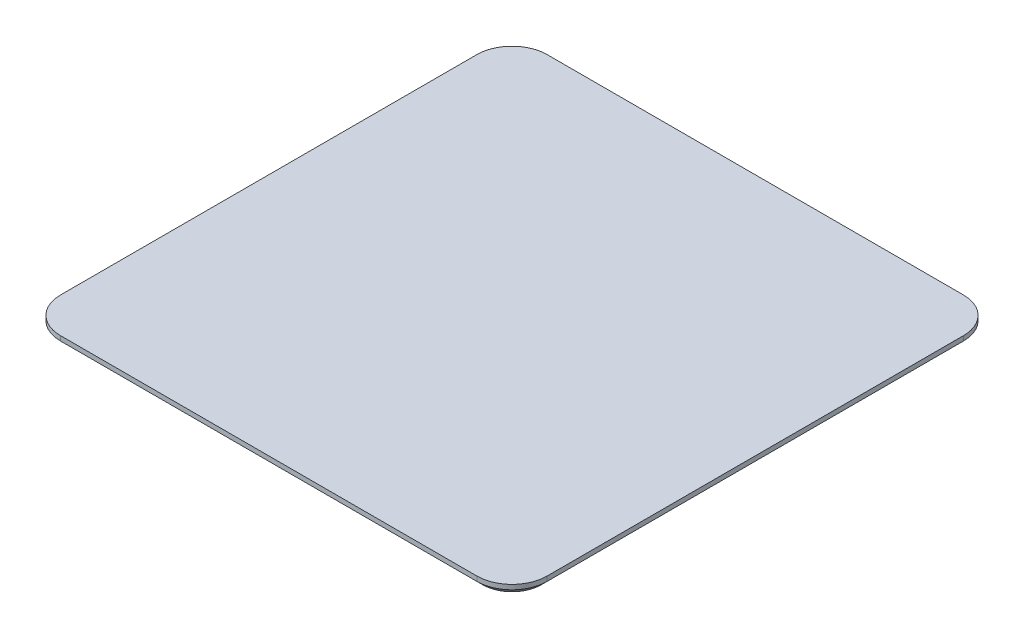
ISO-10303-21;
HEADER;
FILE_DESCRIPTION(('STEP AP214'),'2;1');
FILE_NAME('part.step','',(''),(''),'','','');
FILE_SCHEMA(('AUTOMOTIVE_DESIGN { 1 0 10303 214 1 1 1 1 }'));
ENDSEC;
DATA;
#1=APPLICATION_CONTEXT('core data for automotive mechanical design processes');
#2=APPLICATION_PROTOCOL_DEFINITION('international standard','automotive_design',2000,#1);
#3=PRODUCT_CONTEXT('',#1,'mechanical');
#4=PRODUCT('Part','Part','',(#3));
#5=PRODUCT_RELATED_PRODUCT_CATEGORY('part','',(#4));
#6=PRODUCT_DEFINITION_FORMATION('','',#4);
#7=PRODUCT_DEFINITION_CONTEXT('part definition',#1,'design');
#8=PRODUCT_DEFINITION('design','',#6,#7);
#9=PRODUCT_DEFINITION_SHAPE('','',#8);
#10=(LENGTH_UNIT() NAMED_UNIT(*) SI_UNIT(.MILLI.,.METRE.));
#11=(NAMED_UNIT(*) PLANE_ANGLE_UNIT() SI_UNIT($,.RADIAN.));
#12=(NAMED_UNIT(*) SI_UNIT($,.STERADIAN.) SOLID_ANGLE_UNIT());
#13=UNCERTAINTY_MEASURE_WITH_UNIT(LENGTH_MEASURE(1.E-05),#10,'distance_accuracy_value','');
#14=(GEOMETRIC_REPRESENTATION_CONTEXT(3) GLOBAL_UNCERTAINTY_ASSIGNED_CONTEXT((#13)) GLOBAL_UNIT_ASSIGNED_CONTEXT((#10,
#11,#12)) REPRESENTATION_CONTEXT('',''));
#15=CARTESIAN_POINT('',(0.,0.,0.));
#16=DIRECTION('',(0.,0.,1.));
#17=DIRECTION('',(1.,0.,0.));
#18=AXIS2_PLACEMENT_3D('',#15,#16,#17);
#19=CARTESIAN_POINT('',(20.75,0.9,20.75));
#20=DIRECTION('',(-1.,0.,0.));
#21=DIRECTION('',(0.,0.,1.));
#22=AXIS2_PLACEMENT_3D('',#19,#20,#21);
#23=PLANE('',#22);
#24=DIRECTION('',(0.,-1.,0.));
#25=VECTOR('',#24,1.);
#26=CARTESIAN_POINT('',(20.75,0.9,17.75));
#27=LINE('',#26,#25);
#28=CARTESIAN_POINT('',(20.75,0.9,17.75));
#29=VERTEX_POINT('',#28);
#30=CARTESIAN_POINT('',(20.75,0.5,17.75));
#31=VERTEX_POINT('',#30);
#32=EDGE_CURVE('E180',#29,#31,#27,.T.);
#33=ORIENTED_EDGE('',*,*,#32,.T.);
#34=DIRECTION('',(0.,0.,-1.));
#35=VECTOR('',#34,1.);
#36=CARTESIAN_POINT('',(20.75,0.5,-17.75));
#37=LINE('',#36,#35);
#38=CARTESIAN_POINT('',(20.75,0.5,-17.75));
#39=VERTEX_POINT('',#38);
#40=EDGE_CURVE('E187',#31,#39,#37,.T.);
#41=ORIENTED_EDGE('',*,*,#40,.T.);
#42=DIRECTION('',(0.,-1.,0.));
#43=VECTOR('',#42,1.);
#44=CARTESIAN_POINT('',(20.75,0.9,-17.75));
#45=LINE('',#44,#43);
#46=CARTESIAN_POINT('',(20.75,0.9,-17.75));
#47=VERTEX_POINT('',#46);
#48=EDGE_CURVE('E184',#39,#47,#45,.F.);
#49=ORIENTED_EDGE('',*,*,#48,.T.);
#50=DIRECTION('',(0.,0.,-1.));
#51=VECTOR('',#50,1.);
#52=CARTESIAN_POINT('',(20.75,0.9,20.75));
#53=LINE('',#52,#51);
#54=EDGE_CURVE('E261',#29,#47,#53,.T.);
#55=ORIENTED_EDGE('',*,*,#54,.F.);
#56=EDGE_LOOP('',(#33,#41,#49,#55));
#57=FACE_BOUND('',#56,.T.);
#58=ADVANCED_FACE('F41',(#57),#23,.F.);
#59=CARTESIAN_POINT('',(-20.75,0.9,-20.75));
#60=DIRECTION('',(0.,0.,1.));
#61=DIRECTION('',(1.,0.,0.));
#62=AXIS2_PLACEMENT_3D('',#59,#60,#61);
#63=PLANE('',#62);
#64=DIRECTION('',(0.,-1.,0.));
#65=VECTOR('',#64,1.);
#66=CARTESIAN_POINT('',(17.75,0.9,-20.75));
#67=LINE('',#66,#65);
#68=CARTESIAN_POINT('',(17.75,0.9,-20.75));
#69=VERTEX_POINT('',#68);
#70=CARTESIAN_POINT('',(17.75,0.5,-20.75));
#71=VERTEX_POINT('',#70);
#72=EDGE_CURVE('E154',#69,#71,#67,.T.);
#73=ORIENTED_EDGE('',*,*,#72,.T.);
#74=DIRECTION('',(-1.,0.,0.));
#75=VECTOR('',#74,1.);
#76=CARTESIAN_POINT('',(-17.75,0.5,-20.75));
#77=LINE('',#76,#75);
#78=CARTESIAN_POINT('',(-17.75,0.5,-20.75));
#79=VERTEX_POINT('',#78);
#80=EDGE_CURVE('E222',#71,#79,#77,.T.);
#81=ORIENTED_EDGE('',*,*,#80,.T.);
#82=DIRECTION('',(0.,-1.,0.));
#83=VECTOR('',#82,1.);
#84=CARTESIAN_POINT('',(-17.75,0.9,-20.75));
#85=LINE('',#84,#83);
#86=CARTESIAN_POINT('',(-17.75,0.9,-20.75));
#87=VERTEX_POINT('',#86);
#88=EDGE_CURVE('E159',#79,#87,#85,.F.);
#89=ORIENTED_EDGE('',*,*,#88,.T.);
#90=DIRECTION('',(-1.,0.,0.));
#91=VECTOR('',#90,1.);
#92=CARTESIAN_POINT('',(-20.75,0.9,-20.75));
#93=LINE('',#92,#91);
#94=EDGE_CURVE('E141',#69,#87,#93,.T.);
#95=ORIENTED_EDGE('',*,*,#94,.F.);
#96=EDGE_LOOP('',(#73,#81,#89,#95));
#97=FACE_BOUND('',#96,.T.);
#98=ADVANCED_FACE('F306',(#97),#63,.F.);
#99=CARTESIAN_POINT('',(-20.75,0.9,20.75));
#100=DIRECTION('',(1.,0.,0.));
#101=DIRECTION('',(0.,0.,-1.));
#102=AXIS2_PLACEMENT_3D('',#99,#100,#101);
#103=PLANE('',#102);
#104=DIRECTION('',(0.,-1.,0.));
#105=VECTOR('',#104,1.);
#106=CARTESIAN_POINT('',(-20.75,0.9,-17.75));
#107=LINE('',#106,#105);
#108=CARTESIAN_POINT('',(-20.75,0.9,-17.75));
#109=VERTEX_POINT('',#108);
#110=CARTESIAN_POINT('',(-20.75,0.5,-17.75));
#111=VERTEX_POINT('',#110);
#112=EDGE_CURVE('E147',#109,#111,#107,.T.);
#113=ORIENTED_EDGE('',*,*,#112,.T.);
#114=DIRECTION('',(0.,0.,1.));
#115=VECTOR('',#114,1.);
#116=CARTESIAN_POINT('',(-20.75,0.5,17.75));
#117=LINE('',#116,#115);
#118=CARTESIAN_POINT('',(-20.75,0.5,17.75));
#119=VERTEX_POINT('',#118);
#120=EDGE_CURVE('E11',#111,#119,#117,.T.);
#121=ORIENTED_EDGE('',*,*,#120,.T.);
#122=DIRECTION('',(0.,-1.,0.));
#123=VECTOR('',#122,1.);
#124=CARTESIAN_POINT('',(-20.75,0.9,17.75));
#125=LINE('',#124,#123);
#126=CARTESIAN_POINT('',(-20.75,0.9,17.75));
#127=VERTEX_POINT('',#126);
#128=EDGE_CURVE('E148',#119,#127,#125,.F.);
#129=ORIENTED_EDGE('',*,*,#128,.T.);
#130=DIRECTION('',(0.,0.,1.));
#131=VECTOR('',#130,1.);
#132=CARTESIAN_POINT('',(-20.75,0.9,20.75));
#133=LINE('',#132,#131);
#134=EDGE_CURVE('E138',#109,#127,#133,.T.);
#135=ORIENTED_EDGE('',*,*,#134,.F.);
#136=EDGE_LOOP('',(#113,#121,#129,#135));
#137=FACE_BOUND('',#136,.T.);
#138=ADVANCED_FACE('F146',(#137),#103,.F.);
#139=CARTESIAN_POINT('',(-20.75,0.9,20.75));
#140=DIRECTION('',(0.,0.,-1.));
#141=DIRECTION('',(-1.,0.,0.));
#142=AXIS2_PLACEMENT_3D('',#139,#140,#141);
#143=PLANE('',#142);
#144=DIRECTION('',(0.,-1.,0.));
#145=VECTOR('',#144,1.);
#146=CARTESIAN_POINT('',(-17.75,0.9,20.75));
#147=LINE('',#146,#145);
#148=CARTESIAN_POINT('',(-17.75,0.9,20.75));
#149=VERTEX_POINT('',#148);
#150=CARTESIAN_POINT('',(-17.75,0.5,20.75));
#151=VERTEX_POINT('',#150);
#152=EDGE_CURVE('E176',#149,#151,#147,.T.);
#153=ORIENTED_EDGE('',*,*,#152,.T.);
#154=DIRECTION('',(1.,0.,0.));
#155=VECTOR('',#154,1.);
#156=CARTESIAN_POINT('',(17.75,0.5,20.75));
#157=LINE('',#156,#155);
#158=CARTESIAN_POINT('',(17.75,0.5,20.75));
#159=VERTEX_POINT('',#158);
#160=EDGE_CURVE('E225',#151,#159,#157,.T.);
#161=ORIENTED_EDGE('',*,*,#160,.T.);
#162=DIRECTION('',(0.,-1.,0.));
#163=VECTOR('',#162,1.);
#164=CARTESIAN_POINT('',(17.75,0.9,20.75));
#165=LINE('',#164,#163);
#166=CARTESIAN_POINT('',(17.75,0.9,20.75));
#167=VERTEX_POINT('',#166);
#168=EDGE_CURVE('E143',#159,#167,#165,.F.);
#169=ORIENTED_EDGE('',*,*,#168,.T.);
#170=DIRECTION('',(1.,0.,0.));
#171=VECTOR('',#170,1.);
#172=CARTESIAN_POINT('',(-20.75,0.9,20.75));
#173=LINE('',#172,#171);
#174=EDGE_CURVE('E150',#149,#167,#173,.T.);
#175=ORIENTED_EDGE('',*,*,#174,.F.);
#176=EDGE_LOOP('',(#153,#161,#169,#175));
#177=FACE_BOUND('',#176,.T.);
#178=ADVANCED_FACE('F321',(#177),#143,.F.);
#179=CARTESIAN_POINT('',(0.,0.9,0.));
#180=DIRECTION('',(0.,-1.,0.));
#181=DIRECTION('',(0.,0.,-1.));
#182=AXIS2_PLACEMENT_3D('',#179,#180,#181);
#183=PLANE('',#182);
#184=ORIENTED_EDGE('',*,*,#94,.T.);
#185=CARTESIAN_POINT('',(-17.75,0.9,-17.75));
#186=DIRECTION('',(0.,-1.,0.));
#187=DIRECTION('',(0.,0.,-1.));
#188=AXIS2_PLACEMENT_3D('',#185,#186,#187);
#189=CIRCLE('',#188,3.);
#190=EDGE_CURVE('E135',#87,#109,#189,.F.);
#191=ORIENTED_EDGE('',*,*,#190,.T.);
#192=ORIENTED_EDGE('',*,*,#134,.T.);
#193=CARTESIAN_POINT('',(-17.75,0.9,17.75));
#194=DIRECTION('',(0.,-1.,0.));
#195=DIRECTION('',(0.,0.,-1.));
#196=AXIS2_PLACEMENT_3D('',#193,#194,#195);
#197=CIRCLE('',#196,3.);
#198=EDGE_CURVE('E144',#127,#149,#197,.F.);
#199=ORIENTED_EDGE('',*,*,#198,.T.);
#200=ORIENTED_EDGE('',*,*,#174,.T.);
#201=CARTESIAN_POINT('',(17.75,0.9,17.75));
#202=DIRECTION('',(0.,-1.,0.));
#203=DIRECTION('',(0.,0.,-1.));
#204=AXIS2_PLACEMENT_3D('',#201,#202,#203);
#205=CIRCLE('',#204,3.);
#206=EDGE_CURVE('E166',#167,#29,#205,.F.);
#207=ORIENTED_EDGE('',*,*,#206,.T.);
#208=ORIENTED_EDGE('',*,*,#54,.T.);
#209=CARTESIAN_POINT('',(17.75,0.9,-17.75));
#210=DIRECTION('',(0.,-1.,0.));
#211=DIRECTION('',(0.,0.,-1.));
#212=AXIS2_PLACEMENT_3D('',#209,#210,#211);
#213=CIRCLE('',#212,3.);
#214=EDGE_CURVE('E169',#47,#69,#213,.F.);
#215=ORIENTED_EDGE('',*,*,#214,.T.);
#216=EDGE_LOOP('',(#184,#191,#192,#199,#200,#207,#208,#215));
#217=FACE_BOUND('',#216,.T.);
#218=ADVANCED_FACE('F137',(#217),#183,.F.);
#219=CARTESIAN_POINT('',(0.,0.,0.));
#220=DIRECTION('',(0.,-1.,0.));
#221=DIRECTION('',(0.,0.,-1.));
#222=AXIS2_PLACEMENT_3D('',#219,#220,#221);
#223=PLANE('',#222);
#224=CARTESIAN_POINT('',(17.75,0.,-17.75));
#225=DIRECTION('',(0.,-1.,0.));
#226=DIRECTION('',(0.,0.,-1.));
#227=AXIS2_PLACEMENT_3D('',#224,#225,#226);
#228=CIRCLE('',#227,2.5);
#229=CARTESIAN_POINT('',(17.75,0.,-20.25));
#230=VERTEX_POINT('',#229);
#231=CARTESIAN_POINT('',(20.25,0.,-17.75));
#232=VERTEX_POINT('',#231);
#233=EDGE_CURVE('E209',#230,#232,#228,.T.);
#234=ORIENTED_EDGE('',*,*,#233,.T.);
#235=DIRECTION('',(0.,0.,1.));
#236=VECTOR('',#235,1.);
#237=CARTESIAN_POINT('',(20.25,0.,17.75));
#238=LINE('',#237,#236);
#239=CARTESIAN_POINT('',(20.25,0.,17.75));
#240=VERTEX_POINT('',#239);
#241=EDGE_CURVE('E212',#232,#240,#238,.T.);
#242=ORIENTED_EDGE('',*,*,#241,.T.);
#243=CARTESIAN_POINT('',(17.75,0.,17.75));
#244=DIRECTION('',(0.,-1.,0.));
#245=DIRECTION('',(0.,0.,-1.));
#246=AXIS2_PLACEMENT_3D('',#243,#244,#245);
#247=CIRCLE('',#246,2.5);
#248=CARTESIAN_POINT('',(17.75,0.,20.25));
#249=VERTEX_POINT('',#248);
#250=EDGE_CURVE('E206',#240,#249,#247,.T.);
#251=ORIENTED_EDGE('',*,*,#250,.T.);
#252=DIRECTION('',(-1.,0.,0.));
#253=VECTOR('',#252,1.);
#254=CARTESIAN_POINT('',(-17.75,0.,20.25));
#255=LINE('',#254,#253);
#256=CARTESIAN_POINT('',(-17.75,0.,20.25));
#257=VERTEX_POINT('',#256);
#258=EDGE_CURVE('E200',#249,#257,#255,.T.);
#259=ORIENTED_EDGE('',*,*,#258,.T.);
#260=CARTESIAN_POINT('',(-17.75,0.,17.75));
#261=DIRECTION('',(0.,-1.,0.));
#262=DIRECTION('',(0.,0.,-1.));
#263=AXIS2_PLACEMENT_3D('',#260,#261,#262);
#264=CIRCLE('',#263,2.5);
#265=CARTESIAN_POINT('',(-20.25,0.,17.75));
#266=VERTEX_POINT('',#265);
#267=EDGE_CURVE('E194',#257,#266,#264,.T.);
#268=ORIENTED_EDGE('',*,*,#267,.T.);
#269=DIRECTION('',(0.,0.,-1.));
#270=VECTOR('',#269,1.);
#271=CARTESIAN_POINT('',(-20.25,0.,-17.75));
#272=LINE('',#271,#270);
#273=CARTESIAN_POINT('',(-20.25,0.,-17.75));
#274=VERTEX_POINT('',#273);
#275=EDGE_CURVE('E191',#266,#274,#272,.T.);
#276=ORIENTED_EDGE('',*,*,#275,.T.);
#277=CARTESIAN_POINT('',(-17.75,0.,-17.75));
#278=DIRECTION('',(0.,-1.,0.));
#279=DIRECTION('',(0.,0.,-1.));
#280=AXIS2_PLACEMENT_3D('',#277,#278,#279);
#281=CIRCLE('',#280,2.5);
#282=CARTESIAN_POINT('',(-17.75,0.,-20.25));
#283=VERTEX_POINT('',#282);
#284=EDGE_CURVE('E197',#274,#283,#281,.T.);
#285=ORIENTED_EDGE('',*,*,#284,.T.);
#286=DIRECTION('',(1.,0.,0.));
#287=VECTOR('',#286,1.);
#288=CARTESIAN_POINT('',(17.75,0.,-20.25));
#289=LINE('',#288,#287);
#290=EDGE_CURVE('E203',#283,#230,#289,.T.);
#291=ORIENTED_EDGE('',*,*,#290,.T.);
#292=EDGE_LOOP('',(#234,#242,#251,#259,#268,#276,#285,#291));
#293=FACE_BOUND('',#292,.T.);
#294=ADVANCED_FACE('F313',(#293),#223,.T.);
#295=CARTESIAN_POINT('',(-17.75,0.9,-17.75));
#296=DIRECTION('',(0.,-1.,0.));
#297=DIRECTION('',(0.,0.,-1.));
#298=AXIS2_PLACEMENT_3D('',#295,#296,#297);
#299=CYLINDRICAL_SURFACE('',#298,3.);
#300=ORIENTED_EDGE('',*,*,#88,.F.);
#301=CARTESIAN_POINT('',(-17.75,0.5,-17.75));
#302=DIRECTION('',(0.,-1.,0.));
#303=DIRECTION('',(0.,0.,-1.));
#304=AXIS2_PLACEMENT_3D('',#301,#302,#303);
#305=CIRCLE('',#304,3.);
#306=EDGE_CURVE('E66',#79,#111,#305,.F.);
#307=ORIENTED_EDGE('',*,*,#306,.T.);
#308=ORIENTED_EDGE('',*,*,#112,.F.);
#309=ORIENTED_EDGE('',*,*,#190,.F.);
#310=EDGE_LOOP('',(#300,#307,#308,#309));
#311=FACE_BOUND('',#310,.T.);
#312=ADVANCED_FACE('F152',(#311),#299,.T.);
#313=CARTESIAN_POINT('',(-17.75,0.9,17.75));
#314=DIRECTION('',(0.,-1.,0.));
#315=DIRECTION('',(0.,0.,-1.));
#316=AXIS2_PLACEMENT_3D('',#313,#314,#315);
#317=CYLINDRICAL_SURFACE('',#316,3.);
#318=ORIENTED_EDGE('',*,*,#128,.F.);
#319=CARTESIAN_POINT('',(-17.75,0.5,17.75));
#320=DIRECTION('',(0.,-1.,0.));
#321=DIRECTION('',(0.,0.,-1.));
#322=AXIS2_PLACEMENT_3D('',#319,#320,#321);
#323=CIRCLE('',#322,3.);
#324=EDGE_CURVE('E52',#119,#151,#323,.F.);
#325=ORIENTED_EDGE('',*,*,#324,.T.);
#326=ORIENTED_EDGE('',*,*,#152,.F.);
#327=ORIENTED_EDGE('',*,*,#198,.F.);
#328=EDGE_LOOP('',(#318,#325,#326,#327));
#329=FACE_BOUND('',#328,.T.);
#330=ADVANCED_FACE('F320',(#329),#317,.T.);
#331=CARTESIAN_POINT('',(17.75,0.9,-17.75));
#332=DIRECTION('',(0.,-1.,0.));
#333=DIRECTION('',(0.,0.,-1.));
#334=AXIS2_PLACEMENT_3D('',#331,#332,#333);
#335=CYLINDRICAL_SURFACE('',#334,3.);
#336=ORIENTED_EDGE('',*,*,#48,.F.);
#337=CARTESIAN_POINT('',(17.75,0.5,-17.75));
#338=DIRECTION('',(0.,-1.,0.));
#339=DIRECTION('',(0.,0.,-1.));
#340=AXIS2_PLACEMENT_3D('',#337,#338,#339);
#341=CIRCLE('',#340,3.);
#342=EDGE_CURVE('E216',#39,#71,#341,.F.);
#343=ORIENTED_EDGE('',*,*,#342,.T.);
#344=ORIENTED_EDGE('',*,*,#72,.F.);
#345=ORIENTED_EDGE('',*,*,#214,.F.);
#346=EDGE_LOOP('',(#336,#343,#344,#345));
#347=FACE_BOUND('',#346,.T.);
#348=ADVANCED_FACE('F303',(#347),#335,.T.);
#349=CARTESIAN_POINT('',(17.75,0.9,17.75));
#350=DIRECTION('',(0.,-1.,0.));
#351=DIRECTION('',(0.,0.,-1.));
#352=AXIS2_PLACEMENT_3D('',#349,#350,#351);
#353=CYLINDRICAL_SURFACE('',#352,3.);
#354=ORIENTED_EDGE('',*,*,#168,.F.);
#355=CARTESIAN_POINT('',(17.75,0.5,17.75));
#356=DIRECTION('',(0.,-1.,0.));
#357=DIRECTION('',(0.,0.,-1.));
#358=AXIS2_PLACEMENT_3D('',#355,#356,#357);
#359=CIRCLE('',#358,3.);
#360=EDGE_CURVE('E219',#159,#31,#359,.F.);
#361=ORIENTED_EDGE('',*,*,#360,.T.);
#362=ORIENTED_EDGE('',*,*,#32,.F.);
#363=ORIENTED_EDGE('',*,*,#206,.F.);
#364=EDGE_LOOP('',(#354,#361,#362,#363));
#365=FACE_BOUND('',#364,.T.);
#366=ADVANCED_FACE('F282',(#365),#353,.T.);
#367=CARTESIAN_POINT('',(-20.75,0.5,20.75));
#368=DIRECTION('',(-0.707106781186546,-0.707106781186549,0.));
#369=DIRECTION('',(0.,0.,-1.));
#370=AXIS2_PLACEMENT_3D('',#367,#368,#369);
#371=PLANE('',#370);
#372=DIRECTION('',(-0.70710678118655,0.707106781186545,0.));
#373=VECTOR('',#372,1.);
#374=CARTESIAN_POINT('',(-20.25,0.,-17.75));
#375=LINE('',#374,#373);
#376=EDGE_CURVE('E253',#274,#111,#375,.T.);
#377=ORIENTED_EDGE('',*,*,#376,.F.);
#378=ORIENTED_EDGE('',*,*,#275,.F.);
#379=DIRECTION('',(0.70710678118655,-0.707106781186545,0.));
#380=VECTOR('',#379,1.);
#381=CARTESIAN_POINT('',(-20.75,0.5,17.75));
#382=LINE('',#381,#380);
#383=EDGE_CURVE('E46',#119,#266,#382,.T.);
#384=ORIENTED_EDGE('',*,*,#383,.F.);
#385=ORIENTED_EDGE('',*,*,#120,.F.);
#386=EDGE_LOOP('',(#377,#378,#384,#385));
#387=FACE_BOUND('',#386,.T.);
#388=ADVANCED_FACE('F44',(#387),#371,.T.);
#389=CARTESIAN_POINT('',(-17.75,0.,17.75));
#390=DIRECTION('',(0.,1.,0.));
#391=DIRECTION('',(0.,0.,1.));
#392=AXIS2_PLACEMENT_3D('',#389,#390,#391);
#393=CONICAL_SURFACE('',#392,2.5,0.785398163397449);
#394=ORIENTED_EDGE('',*,*,#383,.T.);
#395=ORIENTED_EDGE('',*,*,#267,.F.);
#396=DIRECTION('',(0.,-0.707106781186547,-0.707106781186547));
#397=VECTOR('',#396,1.);
#398=CARTESIAN_POINT('',(-17.75,0.5,20.75));
#399=LINE('',#398,#397);
#400=EDGE_CURVE('E250',#151,#257,#399,.T.);
#401=ORIENTED_EDGE('',*,*,#400,.F.);
#402=ORIENTED_EDGE('',*,*,#324,.F.);
#403=EDGE_LOOP('',(#394,#395,#401,#402));
#404=FACE_BOUND('',#403,.T.);
#405=ADVANCED_FACE('F317',(#404),#393,.T.);
#406=CARTESIAN_POINT('',(-17.75,0.,-17.75));
#407=DIRECTION('',(0.,1.,0.));
#408=DIRECTION('',(0.,0.,1.));
#409=AXIS2_PLACEMENT_3D('',#406,#407,#408);
#410=CONICAL_SURFACE('',#409,2.5,0.785398163397449);
#411=ORIENTED_EDGE('',*,*,#376,.T.);
#412=ORIENTED_EDGE('',*,*,#306,.F.);
#413=DIRECTION('',(0.,0.707106781186547,-0.707106781186547));
#414=VECTOR('',#413,1.);
#415=CARTESIAN_POINT('',(-17.75,0.,-20.25));
#416=LINE('',#415,#414);
#417=EDGE_CURVE('E246',#283,#79,#416,.T.);
#418=ORIENTED_EDGE('',*,*,#417,.F.);
#419=ORIENTED_EDGE('',*,*,#284,.F.);
#420=EDGE_LOOP('',(#411,#412,#418,#419));
#421=FACE_BOUND('',#420,.T.);
#422=ADVANCED_FACE('F311',(#421),#410,.T.);
#423=CARTESIAN_POINT('',(-20.75,0.5,20.75));
#424=DIRECTION('',(0.,-0.707106781186546,0.707106781186549));
#425=DIRECTION('',(-1.,0.,0.));
#426=AXIS2_PLACEMENT_3D('',#423,#424,#425);
#427=PLANE('',#426);
#428=ORIENTED_EDGE('',*,*,#400,.T.);
#429=ORIENTED_EDGE('',*,*,#258,.F.);
#430=DIRECTION('',(0.,-0.707106781186547,-0.707106781186547));
#431=VECTOR('',#430,1.);
#432=CARTESIAN_POINT('',(17.75,0.5,20.75));
#433=LINE('',#432,#431);
#434=EDGE_CURVE('E242',#159,#249,#433,.T.);
#435=ORIENTED_EDGE('',*,*,#434,.F.);
#436=ORIENTED_EDGE('',*,*,#160,.F.);
#437=EDGE_LOOP('',(#428,#429,#435,#436));
#438=FACE_BOUND('',#437,.T.);
#439=ADVANCED_FACE('F323',(#438),#427,.T.);
#440=CARTESIAN_POINT('',(-20.75,0.5,-20.75));
#441=DIRECTION('',(0.,-0.707106781186549,-0.707106781186546));
#442=DIRECTION('',(1.,0.,0.));
#443=AXIS2_PLACEMENT_3D('',#440,#441,#442);
#444=PLANE('',#443);
#445=ORIENTED_EDGE('',*,*,#417,.T.);
#446=ORIENTED_EDGE('',*,*,#80,.F.);
#447=DIRECTION('',(0.,0.707106781186545,-0.70710678118655));
#448=VECTOR('',#447,1.);
#449=CARTESIAN_POINT('',(17.75,0.,-20.25));
#450=LINE('',#449,#448);
#451=EDGE_CURVE('E238',#230,#71,#450,.T.);
#452=ORIENTED_EDGE('',*,*,#451,.F.);
#453=ORIENTED_EDGE('',*,*,#290,.F.);
#454=EDGE_LOOP('',(#445,#446,#452,#453));
#455=FACE_BOUND('',#454,.T.);
#456=ADVANCED_FACE('F308',(#455),#444,.T.);
#457=CARTESIAN_POINT('',(17.75,0.,17.75));
#458=DIRECTION('',(0.,1.,0.));
#459=DIRECTION('',(0.,0.,1.));
#460=AXIS2_PLACEMENT_3D('',#457,#458,#459);
#461=CONICAL_SURFACE('',#460,2.5,0.785398163397449);
#462=ORIENTED_EDGE('',*,*,#434,.T.);
#463=ORIENTED_EDGE('',*,*,#250,.F.);
#464=DIRECTION('',(-0.707106781186547,-0.707106781186547,0.));
#465=VECTOR('',#464,1.);
#466=CARTESIAN_POINT('',(20.75,0.5,17.75));
#467=LINE('',#466,#465);
#468=EDGE_CURVE('E235',#31,#240,#467,.T.);
#469=ORIENTED_EDGE('',*,*,#468,.F.);
#470=ORIENTED_EDGE('',*,*,#360,.F.);
#471=EDGE_LOOP('',(#462,#463,#469,#470));
#472=FACE_BOUND('',#471,.T.);
#473=ADVANCED_FACE('F291',(#472),#461,.T.);
#474=CARTESIAN_POINT('',(17.75,0.,-17.75));
#475=DIRECTION('',(0.,1.,0.));
#476=DIRECTION('',(0.,0.,1.));
#477=AXIS2_PLACEMENT_3D('',#474,#475,#476);
#478=CONICAL_SURFACE('',#477,2.5,0.785398163397449);
#479=ORIENTED_EDGE('',*,*,#451,.T.);
#480=ORIENTED_EDGE('',*,*,#342,.F.);
#481=DIRECTION('',(0.707106781186547,0.707106781186547,0.));
#482=VECTOR('',#481,1.);
#483=CARTESIAN_POINT('',(20.25,0.,-17.75));
#484=LINE('',#483,#482);
#485=EDGE_CURVE('E232',#232,#39,#484,.T.);
#486=ORIENTED_EDGE('',*,*,#485,.F.);
#487=ORIENTED_EDGE('',*,*,#233,.F.);
#488=EDGE_LOOP('',(#479,#480,#486,#487));
#489=FACE_BOUND('',#488,.T.);
#490=ADVANCED_FACE('F299',(#489),#478,.T.);
#491=CARTESIAN_POINT('',(20.75,0.5,20.75));
#492=DIRECTION('',(0.707106781186549,-0.707106781186546,0.));
#493=DIRECTION('',(0.,0.,1.));
#494=AXIS2_PLACEMENT_3D('',#491,#492,#493);
#495=PLANE('',#494);
#496=ORIENTED_EDGE('',*,*,#468,.T.);
#497=ORIENTED_EDGE('',*,*,#241,.F.);
#498=ORIENTED_EDGE('',*,*,#485,.T.);
#499=ORIENTED_EDGE('',*,*,#40,.F.);
#500=EDGE_LOOP('',(#496,#497,#498,#499));
#501=FACE_BOUND('',#500,.T.);
#502=ADVANCED_FACE('F294',(#501),#495,.T.);
#503=CLOSED_SHELL('',(#58,#98,#138,#178,#218,#294,#312,#330,#348,#366,#388,#405,#422,#439,#456,
#473,#490,#502));
#504=MANIFOLD_SOLID_BREP('B2',#503);
#505=ADVANCED_BREP_SHAPE_REPRESENTATION('',(#18,#504),#14);
#506=SHAPE_DEFINITION_REPRESENTATION(#9,#505);
ENDSEC;
END-ISO-10303-21;
